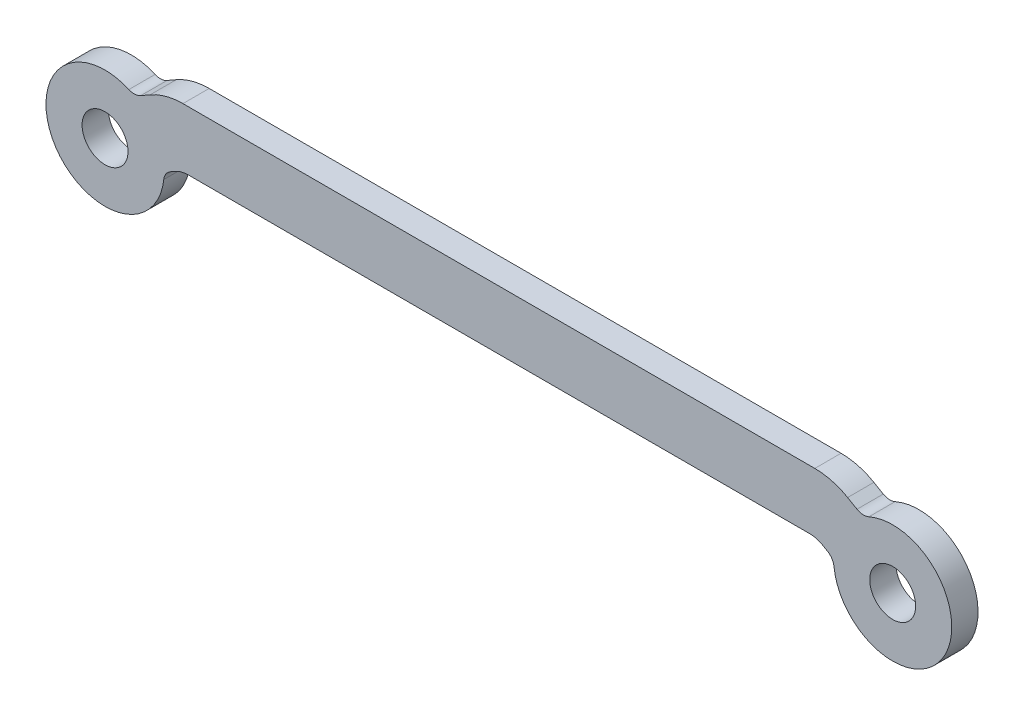
ISO-10303-21;
HEADER;
FILE_DESCRIPTION(('STEP AP214'),'2;1');
FILE_NAME('part.step','',(''),(''),'','','');
FILE_SCHEMA(('AUTOMOTIVE_DESIGN { 1 0 10303 214 1 1 1 1 }'));
ENDSEC;
DATA;
#1=APPLICATION_CONTEXT('core data for automotive mechanical design processes');
#2=APPLICATION_PROTOCOL_DEFINITION('international standard','automotive_design',2000,#1);
#3=PRODUCT_CONTEXT('',#1,'mechanical');
#4=PRODUCT('Part','Part','',(#3));
#5=PRODUCT_RELATED_PRODUCT_CATEGORY('part','',(#4));
#6=PRODUCT_DEFINITION_FORMATION('','',#4);
#7=PRODUCT_DEFINITION_CONTEXT('part definition',#1,'design');
#8=PRODUCT_DEFINITION('design','',#6,#7);
#9=PRODUCT_DEFINITION_SHAPE('','',#8);
#10=(LENGTH_UNIT() NAMED_UNIT(*) SI_UNIT(.MILLI.,.METRE.));
#11=(NAMED_UNIT(*) PLANE_ANGLE_UNIT() SI_UNIT($,.RADIAN.));
#12=(NAMED_UNIT(*) SI_UNIT($,.STERADIAN.) SOLID_ANGLE_UNIT());
#13=UNCERTAINTY_MEASURE_WITH_UNIT(LENGTH_MEASURE(1.E-05),#10,'distance_accuracy_value','');
#14=(GEOMETRIC_REPRESENTATION_CONTEXT(3) GLOBAL_UNCERTAINTY_ASSIGNED_CONTEXT((#13)) GLOBAL_UNIT_ASSIGNED_CONTEXT((#10,
#11,#12)) REPRESENTATION_CONTEXT('',''));
#15=CARTESIAN_POINT('',(0.,0.,0.));
#16=DIRECTION('',(0.,0.,1.));
#17=DIRECTION('',(1.,0.,0.));
#18=AXIS2_PLACEMENT_3D('',#15,#16,#17);
#19=CARTESIAN_POINT('',(54.0669872981077,0.250000000000007,2.));
#20=DIRECTION('',(0.,0.,1.));
#21=DIRECTION('',(1.,0.,0.));
#22=AXIS2_PLACEMENT_3D('',#19,#20,#21);
#23=PLANE('',#22);
#24=CARTESIAN_POINT('',(0.,0.,2.));
#25=DIRECTION('',(0.,0.,1.));
#26=DIRECTION('',(1.,0.,0.));
#27=AXIS2_PLACEMENT_3D('',#24,#25,#26);
#28=CIRCLE('',#27,1.75);
#29=CARTESIAN_POINT('',(1.75000000000005,0.,2.));
#30=VERTEX_POINT('',#29);
#31=EDGE_CURVE('E186',#30,#30,#28,.T.);
#32=ORIENTED_EDGE('',*,*,#31,.F.);
#33=EDGE_LOOP('',(#32));
#34=FACE_BOUND('',#33,.T.);
#35=CARTESIAN_POINT('',(54.0669872981077,0.250000000000007,2.));
#36=DIRECTION('',(0.,0.,1.));
#37=DIRECTION('',(1.,0.,0.));
#38=AXIS2_PLACEMENT_3D('',#35,#36,#37);
#39=CIRCLE('',#38,4.99999999999994);
#40=CARTESIAN_POINT('',(56.5669872981076,4.58012701892215,2.));
#41=VERTEX_POINT('',#40);
#42=CARTESIAN_POINT('',(54.0669872981077,5.24999999999995,2.));
#43=VERTEX_POINT('',#42);
#44=EDGE_CURVE('E213',#41,#43,#39,.T.);
#45=ORIENTED_EDGE('',*,*,#44,.T.);
#46=DIRECTION('',(-1.,0.,0.));
#47=VECTOR('',#46,1.);
#48=CARTESIAN_POINT('',(5.93301270189224,5.25000000000001,2.));
#49=LINE('',#48,#47);
#50=CARTESIAN_POINT('',(5.93301270189224,5.25000000000001,2.));
#51=VERTEX_POINT('',#50);
#52=EDGE_CURVE('E121',#43,#51,#49,.T.);
#53=ORIENTED_EDGE('',*,*,#52,.T.);
#54=CARTESIAN_POINT('',(5.93301270189222,0.250000000000006,2.));
#55=DIRECTION('',(0.,0.,1.));
#56=DIRECTION('',(1.,0.,0.));
#57=AXIS2_PLACEMENT_3D('',#54,#55,#56);
#58=CIRCLE('',#57,5.);
#59=CARTESIAN_POINT('',(3.4330127018922,4.58012701892219,2.));
#60=VERTEX_POINT('',#59);
#61=EDGE_CURVE('E252',#51,#60,#58,.T.);
#62=ORIENTED_EDGE('',*,*,#61,.T.);
#63=DIRECTION('',(-0.866025403784438,-0.500000000000001,0.));
#64=VECTOR('',#63,1.);
#65=CARTESIAN_POINT('',(2.71760653723484,4.16708707717735,2.));
#66=LINE('',#65,#64);
#67=CARTESIAN_POINT('',(2.71760653723484,4.16708707717735,2.));
#68=VERTEX_POINT('',#67);
#69=EDGE_CURVE('E271',#60,#68,#66,.T.);
#70=ORIENTED_EDGE('',*,*,#69,.T.);
#71=CARTESIAN_POINT('',(2.21760653723484,5.03311248096178,2.));
#72=DIRECTION('',(0.,0.,-1.));
#73=DIRECTION('',(-1.,0.,0.));
#74=AXIS2_PLACEMENT_3D('',#71,#72,#73);
#75=CIRCLE('',#74,0.999999999999999);
#76=CARTESIAN_POINT('',(1.8144053486467,4.11800112078693,2.));
#77=VERTEX_POINT('',#76);
#78=EDGE_CURVE('E268',#68,#77,#75,.T.);
#79=ORIENTED_EDGE('',*,*,#78,.T.);
#80=CARTESIAN_POINT('',(0.,0.,2.));
#81=DIRECTION('',(0.,0.,1.));
#82=DIRECTION('',(1.,0.,0.));
#83=AXIS2_PLACEMENT_3D('',#80,#81,#82);
#84=CIRCLE('',#83,4.49999999999994);
#85=CARTESIAN_POINT('',(4.4734962577376,-0.487679435703051,2.));
#86=VERTEX_POINT('',#85);
#87=EDGE_CURVE('E270',#77,#86,#84,.T.);
#88=ORIENTED_EDGE('',*,*,#87,.T.);
#89=CARTESIAN_POINT('',(5.46760653723485,-0.596052643637063,2.));
#90=DIRECTION('',(0.,0.,-1.));
#91=DIRECTION('',(1.,0.,0.));
#92=AXIS2_PLACEMENT_3D('',#89,#90,#91);
#93=CIRCLE('',#92,1.);
#94=CARTESIAN_POINT('',(4.96760653723485,0.269972760147376,2.));
#95=VERTEX_POINT('',#94);
#96=EDGE_CURVE('E273',#86,#95,#93,.T.);
#97=ORIENTED_EDGE('',*,*,#96,.T.);
#98=DIRECTION('',(0.866025403784437,0.500000000000002,0.));
#99=VECTOR('',#98,1.);
#100=CARTESIAN_POINT('',(5.32105175560817,0.474034452119,2.));
#101=LINE('',#100,#99);
#102=CARTESIAN_POINT('',(5.32105175560817,0.474034452119,2.));
#103=VERTEX_POINT('',#102);
#104=EDGE_CURVE('E279',#95,#103,#101,.T.);
#105=ORIENTED_EDGE('',*,*,#104,.T.);
#106=CARTESIAN_POINT('',(6.35096920143865,-1.30983489166095,2.));
#107=DIRECTION('',(0.,0.,-1.));
#108=DIRECTION('',(1.,0.,0.));
#109=AXIS2_PLACEMENT_3D('',#106,#107,#108);
#110=CIRCLE('',#109,2.05983489166095);
#111=CARTESIAN_POINT('',(6.35096920143865,0.750000000000002,2.));
#112=VERTEX_POINT('',#111);
#113=EDGE_CURVE('E281',#103,#112,#110,.T.);
#114=ORIENTED_EDGE('',*,*,#113,.T.);
#115=DIRECTION('',(1.,0.,0.));
#116=VECTOR('',#115,1.);
#117=CARTESIAN_POINT('',(53.665063509461,0.749999999999949,2.));
#118=LINE('',#117,#116);
#119=CARTESIAN_POINT('',(53.665063509461,0.749999999999938,2.));
#120=VERTEX_POINT('',#119);
#121=EDGE_CURVE('E283',#112,#120,#118,.T.);
#122=ORIENTED_EDGE('',*,*,#121,.T.);
#123=CARTESIAN_POINT('',(53.665063509461,-1.24999999999999,2.));
#124=DIRECTION('',(0.,0.,-1.));
#125=DIRECTION('',(1.,0.,0.));
#126=AXIS2_PLACEMENT_3D('',#123,#124,#125);
#127=CIRCLE('',#126,1.99999999999993);
#128=CARTESIAN_POINT('',(54.665063509461,0.482050807568832,2.));
#129=VERTEX_POINT('',#128);
#130=EDGE_CURVE('E285',#120,#129,#127,.T.);
#131=ORIENTED_EDGE('',*,*,#130,.T.);
#132=DIRECTION('',(0.866025403784446,-0.499999999999987,0.));
#133=VECTOR('',#132,1.);
#134=CARTESIAN_POINT('',(55.0323934627651,0.269972760147251,2.));
#135=LINE('',#134,#133);
#136=CARTESIAN_POINT('',(55.0323934627652,0.26997276014726,2.));
#137=VERTEX_POINT('',#136);
#138=EDGE_CURVE('E287',#129,#137,#135,.T.);
#139=ORIENTED_EDGE('',*,*,#138,.T.);
#140=CARTESIAN_POINT('',(54.5323934627651,-0.596052643637157,2.));
#141=DIRECTION('',(0.,0.,-1.));
#142=DIRECTION('',(-1.,0.,0.));
#143=AXIS2_PLACEMENT_3D('',#140,#141,#142);
#144=CIRCLE('',#143,0.999999999999985);
#145=CARTESIAN_POINT('',(55.5265037422624,-0.487679435703169,2.));
#146=VERTEX_POINT('',#145);
#147=EDGE_CURVE('E164',#137,#146,#144,.T.);
#148=ORIENTED_EDGE('',*,*,#147,.T.);
#149=CARTESIAN_POINT('',(60.,0.,2.));
#150=DIRECTION('',(0.,0.,1.));
#151=DIRECTION('',(1.,0.,0.));
#152=AXIS2_PLACEMENT_3D('',#149,#150,#151);
#153=CIRCLE('',#152,4.49999999999999);
#154=CARTESIAN_POINT('',(58.1855946513533,4.11800112078682,2.));
#155=VERTEX_POINT('',#154);
#156=EDGE_CURVE('E158',#146,#155,#153,.T.);
#157=ORIENTED_EDGE('',*,*,#156,.T.);
#158=CARTESIAN_POINT('',(57.7823934627651,5.03311248096171,2.));
#159=DIRECTION('',(0.,0.,-1.));
#160=DIRECTION('',(1.,0.,0.));
#161=AXIS2_PLACEMENT_3D('',#158,#159,#160);
#162=CIRCLE('',#161,1.00000000000001);
#163=CARTESIAN_POINT('',(57.2823934627651,4.16708707717725,2.));
#164=VERTEX_POINT('',#163);
#165=EDGE_CURVE('E162',#155,#164,#162,.T.);
#166=ORIENTED_EDGE('',*,*,#165,.T.);
#167=DIRECTION('',(-0.866025403784443,0.499999999999992,0.));
#168=VECTOR('',#167,1.);
#169=CARTESIAN_POINT('',(56.5669872981076,4.58012701892215,2.));
#170=LINE('',#169,#168);
#171=EDGE_CURVE('E54',#164,#41,#170,.T.);
#172=ORIENTED_EDGE('',*,*,#171,.T.);
#173=EDGE_LOOP('',(#45,#53,#62,#70,#79,#88,#97,#105,#114,#122,#131,#139,#148,#157,#166,#172));
#174=FACE_BOUND('',#173,.T.);
#175=CARTESIAN_POINT('',(60.,0.,2.));
#176=DIRECTION('',(0.,0.,1.));
#177=DIRECTION('',(1.,0.,0.));
#178=AXIS2_PLACEMENT_3D('',#175,#176,#177);
#179=CIRCLE('',#178,1.75);
#180=CARTESIAN_POINT('',(61.75,0.,2.));
#181=VERTEX_POINT('',#180);
#182=EDGE_CURVE('E329',#181,#181,#179,.T.);
#183=ORIENTED_EDGE('',*,*,#182,.F.);
#184=EDGE_LOOP('',(#183));
#185=FACE_BOUND('',#184,.T.);
#186=ADVANCED_FACE('F37',(#34,#174,#185),#23,.T.);
#187=CARTESIAN_POINT('',(54.0669872981077,0.250000000000007,0.));
#188=DIRECTION('',(0.,0.,1.));
#189=DIRECTION('',(1.,0.,0.));
#190=AXIS2_PLACEMENT_3D('',#187,#188,#189);
#191=PLANE('',#190);
#192=CARTESIAN_POINT('',(54.0669872981077,0.250000000000007,0.));
#193=DIRECTION('',(0.,0.,1.));
#194=DIRECTION('',(1.,0.,0.));
#195=AXIS2_PLACEMENT_3D('',#192,#193,#194);
#196=CIRCLE('',#195,4.99999999999994);
#197=CARTESIAN_POINT('',(56.5669872981076,4.58012701892215,0.));
#198=VERTEX_POINT('',#197);
#199=CARTESIAN_POINT('',(54.0669872981077,5.24999999999995,0.));
#200=VERTEX_POINT('',#199);
#201=EDGE_CURVE('E182',#198,#200,#196,.T.);
#202=ORIENTED_EDGE('',*,*,#201,.F.);
#203=DIRECTION('',(-0.866025403784443,0.499999999999992,0.));
#204=VECTOR('',#203,1.);
#205=CARTESIAN_POINT('',(56.5669872981076,4.58012701892215,0.));
#206=LINE('',#205,#204);
#207=CARTESIAN_POINT('',(57.2823934627651,4.16708707717725,0.));
#208=VERTEX_POINT('',#207);
#209=EDGE_CURVE('E113',#208,#198,#206,.T.);
#210=ORIENTED_EDGE('',*,*,#209,.F.);
#211=CARTESIAN_POINT('',(57.7823934627651,5.03311248096171,0.));
#212=DIRECTION('',(0.,0.,-1.));
#213=DIRECTION('',(1.,0.,0.));
#214=AXIS2_PLACEMENT_3D('',#211,#212,#213);
#215=CIRCLE('',#214,1.00000000000001);
#216=CARTESIAN_POINT('',(58.1855946513533,4.11800112078682,0.));
#217=VERTEX_POINT('',#216);
#218=EDGE_CURVE('E107',#217,#208,#215,.T.);
#219=ORIENTED_EDGE('',*,*,#218,.F.);
#220=CARTESIAN_POINT('',(60.,0.,0.));
#221=DIRECTION('',(0.,0.,1.));
#222=DIRECTION('',(1.,0.,0.));
#223=AXIS2_PLACEMENT_3D('',#220,#221,#222);
#224=CIRCLE('',#223,4.49999999999999);
#225=CARTESIAN_POINT('',(55.5265037422624,-0.487679435703169,0.));
#226=VERTEX_POINT('',#225);
#227=EDGE_CURVE('E172',#226,#217,#224,.T.);
#228=ORIENTED_EDGE('',*,*,#227,.F.);
#229=CARTESIAN_POINT('',(54.5323934627651,-0.596052643637157,0.));
#230=DIRECTION('',(0.,0.,-1.));
#231=DIRECTION('',(-1.,0.,0.));
#232=AXIS2_PLACEMENT_3D('',#229,#230,#231);
#233=CIRCLE('',#232,0.999999999999985);
#234=CARTESIAN_POINT('',(55.0323934627652,0.26997276014726,0.));
#235=VERTEX_POINT('',#234);
#236=EDGE_CURVE('E208',#235,#226,#233,.T.);
#237=ORIENTED_EDGE('',*,*,#236,.F.);
#238=DIRECTION('',(0.866025403784446,-0.499999999999987,0.));
#239=VECTOR('',#238,1.);
#240=CARTESIAN_POINT('',(55.0323934627651,0.269972760147251,0.));
#241=LINE('',#240,#239);
#242=CARTESIAN_POINT('',(54.665063509461,0.482050807568832,0.));
#243=VERTEX_POINT('',#242);
#244=EDGE_CURVE('E206',#243,#235,#241,.T.);
#245=ORIENTED_EDGE('',*,*,#244,.F.);
#246=CARTESIAN_POINT('',(53.665063509461,-1.24999999999999,0.));
#247=DIRECTION('',(0.,0.,-1.));
#248=DIRECTION('',(1.,0.,0.));
#249=AXIS2_PLACEMENT_3D('',#246,#247,#248);
#250=CIRCLE('',#249,1.99999999999993);
#251=CARTESIAN_POINT('',(53.665063509461,0.749999999999938,0.));
#252=VERTEX_POINT('',#251);
#253=EDGE_CURVE('E204',#252,#243,#250,.T.);
#254=ORIENTED_EDGE('',*,*,#253,.F.);
#255=DIRECTION('',(1.,0.,0.));
#256=VECTOR('',#255,1.);
#257=CARTESIAN_POINT('',(53.665063509461,0.749999999999949,0.));
#258=LINE('',#257,#256);
#259=CARTESIAN_POINT('',(6.35096920143865,0.750000000000002,0.));
#260=VERTEX_POINT('',#259);
#261=EDGE_CURVE('E202',#260,#252,#258,.T.);
#262=ORIENTED_EDGE('',*,*,#261,.F.);
#263=CARTESIAN_POINT('',(6.35096920143865,-1.30983489166095,0.));
#264=DIRECTION('',(0.,0.,-1.));
#265=DIRECTION('',(1.,0.,0.));
#266=AXIS2_PLACEMENT_3D('',#263,#264,#265);
#267=CIRCLE('',#266,2.05983489166095);
#268=CARTESIAN_POINT('',(5.32105175560817,0.474034452119,0.));
#269=VERTEX_POINT('',#268);
#270=EDGE_CURVE('E200',#269,#260,#267,.T.);
#271=ORIENTED_EDGE('',*,*,#270,.F.);
#272=DIRECTION('',(0.866025403784437,0.500000000000002,0.));
#273=VECTOR('',#272,1.);
#274=CARTESIAN_POINT('',(5.32105175560817,0.474034452119,0.));
#275=LINE('',#274,#273);
#276=CARTESIAN_POINT('',(4.96760653723485,0.269972760147376,0.));
#277=VERTEX_POINT('',#276);
#278=EDGE_CURVE('E198',#277,#269,#275,.T.);
#279=ORIENTED_EDGE('',*,*,#278,.F.);
#280=CARTESIAN_POINT('',(5.46760653723485,-0.596052643637063,0.));
#281=DIRECTION('',(0.,0.,-1.));
#282=DIRECTION('',(1.,0.,0.));
#283=AXIS2_PLACEMENT_3D('',#280,#281,#282);
#284=CIRCLE('',#283,1.);
#285=CARTESIAN_POINT('',(4.4734962577376,-0.487679435703051,0.));
#286=VERTEX_POINT('',#285);
#287=EDGE_CURVE('E196',#286,#277,#284,.T.);
#288=ORIENTED_EDGE('',*,*,#287,.F.);
#289=CARTESIAN_POINT('',(0.,0.,0.));
#290=DIRECTION('',(0.,0.,1.));
#291=DIRECTION('',(1.,0.,0.));
#292=AXIS2_PLACEMENT_3D('',#289,#290,#291);
#293=CIRCLE('',#292,4.49999999999994);
#294=CARTESIAN_POINT('',(1.8144053486467,4.11800112078693,0.));
#295=VERTEX_POINT('',#294);
#296=EDGE_CURVE('E194',#295,#286,#293,.T.);
#297=ORIENTED_EDGE('',*,*,#296,.F.);
#298=CARTESIAN_POINT('',(2.21760653723484,5.03311248096178,0.));
#299=DIRECTION('',(0.,0.,-1.));
#300=DIRECTION('',(-1.,0.,0.));
#301=AXIS2_PLACEMENT_3D('',#298,#299,#300);
#302=CIRCLE('',#301,0.999999999999999);
#303=CARTESIAN_POINT('',(2.71760653723484,4.16708707717735,0.));
#304=VERTEX_POINT('',#303);
#305=EDGE_CURVE('E192',#304,#295,#302,.T.);
#306=ORIENTED_EDGE('',*,*,#305,.F.);
#307=DIRECTION('',(-0.866025403784438,-0.500000000000001,0.));
#308=VECTOR('',#307,1.);
#309=CARTESIAN_POINT('',(2.71760653723484,4.16708707717735,0.));
#310=LINE('',#309,#308);
#311=CARTESIAN_POINT('',(3.4330127018922,4.58012701892219,0.));
#312=VERTEX_POINT('',#311);
#313=EDGE_CURVE('E190',#312,#304,#310,.T.);
#314=ORIENTED_EDGE('',*,*,#313,.F.);
#315=CARTESIAN_POINT('',(5.93301270189222,0.250000000000006,0.));
#316=DIRECTION('',(0.,0.,1.));
#317=DIRECTION('',(1.,0.,0.));
#318=AXIS2_PLACEMENT_3D('',#315,#316,#317);
#319=CIRCLE('',#318,5.);
#320=CARTESIAN_POINT('',(5.93301270189224,5.25000000000001,0.));
#321=VERTEX_POINT('',#320);
#322=EDGE_CURVE('E188',#321,#312,#319,.T.);
#323=ORIENTED_EDGE('',*,*,#322,.F.);
#324=DIRECTION('',(-1.,0.,0.));
#325=VECTOR('',#324,1.);
#326=CARTESIAN_POINT('',(5.93301270189224,5.25000000000001,0.));
#327=LINE('',#326,#325);
#328=EDGE_CURVE('E185',#200,#321,#327,.T.);
#329=ORIENTED_EDGE('',*,*,#328,.F.);
#330=EDGE_LOOP('',(#202,#210,#219,#228,#237,#245,#254,#262,#271,#279,#288,#297,#306,#314,#323,#329));
#331=FACE_BOUND('',#330,.T.);
#332=CARTESIAN_POINT('',(0.,0.,0.));
#333=DIRECTION('',(0.,0.,1.));
#334=DIRECTION('',(1.,0.,0.));
#335=AXIS2_PLACEMENT_3D('',#332,#333,#334);
#336=CIRCLE('',#335,1.75);
#337=CARTESIAN_POINT('',(1.75000000000005,0.,0.));
#338=VERTEX_POINT('',#337);
#339=EDGE_CURVE('E335',#338,#338,#336,.T.);
#340=ORIENTED_EDGE('',*,*,#339,.T.);
#341=EDGE_LOOP('',(#340));
#342=FACE_BOUND('',#341,.T.);
#343=CARTESIAN_POINT('',(60.,0.,0.));
#344=DIRECTION('',(0.,0.,1.));
#345=DIRECTION('',(1.,0.,0.));
#346=AXIS2_PLACEMENT_3D('',#343,#344,#345);
#347=CIRCLE('',#346,1.75);
#348=CARTESIAN_POINT('',(61.75,0.,0.));
#349=VERTEX_POINT('',#348);
#350=EDGE_CURVE('E332',#349,#349,#347,.T.);
#351=ORIENTED_EDGE('',*,*,#350,.T.);
#352=EDGE_LOOP('',(#351));
#353=FACE_BOUND('',#352,.T.);
#354=ADVANCED_FACE('F256',(#331,#342,#353),#191,.F.);
#355=CARTESIAN_POINT('',(54.0669872981077,0.250000000000007,2.));
#356=DIRECTION('',(0.,0.,-1.));
#357=DIRECTION('',(-1.,0.,0.));
#358=AXIS2_PLACEMENT_3D('',#355,#356,#357);
#359=CYLINDRICAL_SURFACE('',#358,4.99999999999994);
#360=ORIENTED_EDGE('',*,*,#201,.T.);
#361=DIRECTION('',(0.,0.,-1.));
#362=VECTOR('',#361,1.);
#363=CARTESIAN_POINT('',(54.0669872981077,5.24999999999995,2.));
#364=LINE('',#363,#362);
#365=EDGE_CURVE('E11',#43,#200,#364,.T.);
#366=ORIENTED_EDGE('',*,*,#365,.F.);
#367=ORIENTED_EDGE('',*,*,#44,.F.);
#368=DIRECTION('',(0.,0.,-1.));
#369=VECTOR('',#368,1.);
#370=CARTESIAN_POINT('',(56.5669872981076,4.58012701892215,2.));
#371=LINE('',#370,#369);
#372=EDGE_CURVE('E178',#41,#198,#371,.T.);
#373=ORIENTED_EDGE('',*,*,#372,.T.);
#374=EDGE_LOOP('',(#360,#366,#367,#373));
#375=FACE_BOUND('',#374,.T.);
#376=ADVANCED_FACE('F39',(#375),#359,.T.);
#377=CARTESIAN_POINT('',(5.93301270189224,5.25000000000001,2.));
#378=DIRECTION('',(0.,-1.,0.));
#379=DIRECTION('',(1.,0.,0.));
#380=AXIS2_PLACEMENT_3D('',#377,#378,#379);
#381=PLANE('',#380);
#382=ORIENTED_EDGE('',*,*,#328,.T.);
#383=DIRECTION('',(0.,0.,-1.));
#384=VECTOR('',#383,1.);
#385=CARTESIAN_POINT('',(5.93301270189224,5.25000000000001,2.));
#386=LINE('',#385,#384);
#387=EDGE_CURVE('E46',#51,#321,#386,.T.);
#388=ORIENTED_EDGE('',*,*,#387,.F.);
#389=ORIENTED_EDGE('',*,*,#52,.F.);
#390=ORIENTED_EDGE('',*,*,#365,.T.);
#391=EDGE_LOOP('',(#382,#388,#389,#390));
#392=FACE_BOUND('',#391,.T.);
#393=ADVANCED_FACE('F440',(#392),#381,.F.);
#394=CARTESIAN_POINT('',(5.93301270189222,0.250000000000006,2.));
#395=DIRECTION('',(0.,0.,-1.));
#396=DIRECTION('',(-1.,0.,0.));
#397=AXIS2_PLACEMENT_3D('',#394,#395,#396);
#398=CYLINDRICAL_SURFACE('',#397,5.);
#399=ORIENTED_EDGE('',*,*,#322,.T.);
#400=DIRECTION('',(0.,0.,-1.));
#401=VECTOR('',#400,1.);
#402=CARTESIAN_POINT('',(3.4330127018922,4.58012701892219,2.));
#403=LINE('',#402,#401);
#404=EDGE_CURVE('E244',#60,#312,#403,.T.);
#405=ORIENTED_EDGE('',*,*,#404,.F.);
#406=ORIENTED_EDGE('',*,*,#61,.F.);
#407=ORIENTED_EDGE('',*,*,#387,.T.);
#408=EDGE_LOOP('',(#399,#405,#406,#407));
#409=FACE_BOUND('',#408,.T.);
#410=ADVANCED_FACE('F250',(#409),#398,.T.);
#411=CARTESIAN_POINT('',(2.71760653723484,4.16708707717735,2.));
#412=DIRECTION('',(0.500000000000001,-0.866025403784438,0.));
#413=DIRECTION('',(0.866025403784438,0.500000000000001,0.));
#414=AXIS2_PLACEMENT_3D('',#411,#412,#413);
#415=PLANE('',#414);
#416=ORIENTED_EDGE('',*,*,#313,.T.);
#417=DIRECTION('',(0.,0.,-1.));
#418=VECTOR('',#417,1.);
#419=CARTESIAN_POINT('',(2.71760653723484,4.16708707717735,2.));
#420=LINE('',#419,#418);
#421=EDGE_CURVE('E241',#68,#304,#420,.T.);
#422=ORIENTED_EDGE('',*,*,#421,.F.);
#423=ORIENTED_EDGE('',*,*,#69,.F.);
#424=ORIENTED_EDGE('',*,*,#404,.T.);
#425=EDGE_LOOP('',(#416,#422,#423,#424));
#426=FACE_BOUND('',#425,.T.);
#427=ADVANCED_FACE('F262',(#426),#415,.F.);
#428=CARTESIAN_POINT('',(2.21760653723484,5.03311248096178,2.));
#429=DIRECTION('',(0.,0.,-1.));
#430=DIRECTION('',(-1.,0.,0.));
#431=AXIS2_PLACEMENT_3D('',#428,#429,#430);
#432=CYLINDRICAL_SURFACE('',#431,0.999999999999999);
#433=ORIENTED_EDGE('',*,*,#305,.T.);
#434=DIRECTION('',(0.,0.,-1.));
#435=VECTOR('',#434,1.);
#436=CARTESIAN_POINT('',(1.8144053486467,4.11800112078693,2.));
#437=LINE('',#436,#435);
#438=EDGE_CURVE('E238',#77,#295,#437,.T.);
#439=ORIENTED_EDGE('',*,*,#438,.F.);
#440=ORIENTED_EDGE('',*,*,#78,.F.);
#441=ORIENTED_EDGE('',*,*,#421,.T.);
#442=EDGE_LOOP('',(#433,#439,#440,#441));
#443=FACE_BOUND('',#442,.T.);
#444=ADVANCED_FACE('F266',(#443),#432,.F.);
#445=CARTESIAN_POINT('',(0.,0.,2.));
#446=DIRECTION('',(0.,0.,-1.));
#447=DIRECTION('',(-1.,0.,0.));
#448=AXIS2_PLACEMENT_3D('',#445,#446,#447);
#449=CYLINDRICAL_SURFACE('',#448,4.49999999999994);
#450=ORIENTED_EDGE('',*,*,#296,.T.);
#451=DIRECTION('',(0.,0.,-1.));
#452=VECTOR('',#451,1.);
#453=CARTESIAN_POINT('',(4.4734962577376,-0.487679435703051,2.));
#454=LINE('',#453,#452);
#455=EDGE_CURVE('E235',#86,#286,#454,.T.);
#456=ORIENTED_EDGE('',*,*,#455,.F.);
#457=ORIENTED_EDGE('',*,*,#87,.F.);
#458=ORIENTED_EDGE('',*,*,#438,.T.);
#459=EDGE_LOOP('',(#450,#456,#457,#458));
#460=FACE_BOUND('',#459,.T.);
#461=ADVANCED_FACE('F413',(#460),#449,.T.);
#462=CARTESIAN_POINT('',(5.46760653723485,-0.596052643637063,2.));
#463=DIRECTION('',(0.,0.,-1.));
#464=DIRECTION('',(-1.,0.,0.));
#465=AXIS2_PLACEMENT_3D('',#462,#463,#464);
#466=CYLINDRICAL_SURFACE('',#465,1.);
#467=ORIENTED_EDGE('',*,*,#287,.T.);
#468=DIRECTION('',(0.,0.,-1.));
#469=VECTOR('',#468,1.);
#470=CARTESIAN_POINT('',(4.96760653723485,0.269972760147376,2.));
#471=LINE('',#470,#469);
#472=EDGE_CURVE('E232',#95,#277,#471,.T.);
#473=ORIENTED_EDGE('',*,*,#472,.F.);
#474=ORIENTED_EDGE('',*,*,#96,.F.);
#475=ORIENTED_EDGE('',*,*,#455,.T.);
#476=EDGE_LOOP('',(#467,#473,#474,#475));
#477=FACE_BOUND('',#476,.T.);
#478=ADVANCED_FACE('F405',(#477),#466,.F.);
#479=CARTESIAN_POINT('',(5.32105175560817,0.474034452119,2.));
#480=DIRECTION('',(-0.500000000000002,0.866025403784438,0.));
#481=DIRECTION('',(-0.866025403784437,-0.500000000000002,0.));
#482=AXIS2_PLACEMENT_3D('',#479,#480,#481);
#483=PLANE('',#482);
#484=ORIENTED_EDGE('',*,*,#278,.T.);
#485=DIRECTION('',(0.,0.,-1.));
#486=VECTOR('',#485,1.);
#487=CARTESIAN_POINT('',(5.32105175560817,0.474034452119,2.));
#488=LINE('',#487,#486);
#489=EDGE_CURVE('E229',#103,#269,#488,.T.);
#490=ORIENTED_EDGE('',*,*,#489,.F.);
#491=ORIENTED_EDGE('',*,*,#104,.F.);
#492=ORIENTED_EDGE('',*,*,#472,.T.);
#493=EDGE_LOOP('',(#484,#490,#491,#492));
#494=FACE_BOUND('',#493,.T.);
#495=ADVANCED_FACE('F397',(#494),#483,.F.);
#496=CARTESIAN_POINT('',(6.35096920143865,-1.30983489166095,2.));
#497=DIRECTION('',(0.,0.,-1.));
#498=DIRECTION('',(-1.,0.,0.));
#499=AXIS2_PLACEMENT_3D('',#496,#497,#498);
#500=CYLINDRICAL_SURFACE('',#499,2.05983489166095);
#501=ORIENTED_EDGE('',*,*,#270,.T.);
#502=DIRECTION('',(0.,0.,-1.));
#503=VECTOR('',#502,1.);
#504=CARTESIAN_POINT('',(6.35096920143865,0.750000000000002,2.));
#505=LINE('',#504,#503);
#506=EDGE_CURVE('E226',#112,#260,#505,.T.);
#507=ORIENTED_EDGE('',*,*,#506,.F.);
#508=ORIENTED_EDGE('',*,*,#113,.F.);
#509=ORIENTED_EDGE('',*,*,#489,.T.);
#510=EDGE_LOOP('',(#501,#507,#508,#509));
#511=FACE_BOUND('',#510,.T.);
#512=ADVANCED_FACE('F389',(#511),#500,.F.);
#513=CARTESIAN_POINT('',(53.665063509461,0.749999999999949,2.));
#514=DIRECTION('',(0.,1.,0.));
#515=DIRECTION('',(-1.,0.,0.));
#516=AXIS2_PLACEMENT_3D('',#513,#514,#515);
#517=PLANE('',#516);
#518=ORIENTED_EDGE('',*,*,#261,.T.);
#519=DIRECTION('',(0.,0.,-1.));
#520=VECTOR('',#519,1.);
#521=CARTESIAN_POINT('',(53.665063509461,0.749999999999938,2.));
#522=LINE('',#521,#520);
#523=EDGE_CURVE('E223',#120,#252,#522,.T.);
#524=ORIENTED_EDGE('',*,*,#523,.F.);
#525=ORIENTED_EDGE('',*,*,#121,.F.);
#526=ORIENTED_EDGE('',*,*,#506,.T.);
#527=EDGE_LOOP('',(#518,#524,#525,#526));
#528=FACE_BOUND('',#527,.T.);
#529=ADVANCED_FACE('F381',(#528),#517,.F.);
#530=CARTESIAN_POINT('',(53.665063509461,-1.24999999999999,2.));
#531=DIRECTION('',(0.,0.,-1.));
#532=DIRECTION('',(-1.,0.,0.));
#533=AXIS2_PLACEMENT_3D('',#530,#531,#532);
#534=CYLINDRICAL_SURFACE('',#533,1.99999999999993);
#535=ORIENTED_EDGE('',*,*,#253,.T.);
#536=DIRECTION('',(0.,0.,-1.));
#537=VECTOR('',#536,1.);
#538=CARTESIAN_POINT('',(54.665063509461,0.482050807568832,2.));
#539=LINE('',#538,#537);
#540=EDGE_CURVE('E220',#129,#243,#539,.T.);
#541=ORIENTED_EDGE('',*,*,#540,.F.);
#542=ORIENTED_EDGE('',*,*,#130,.F.);
#543=ORIENTED_EDGE('',*,*,#523,.T.);
#544=EDGE_LOOP('',(#535,#541,#542,#543));
#545=FACE_BOUND('',#544,.T.);
#546=ADVANCED_FACE('F374',(#545),#534,.F.);
#547=CARTESIAN_POINT('',(55.0323934627651,0.269972760147251,2.));
#548=DIRECTION('',(0.499999999999987,0.866025403784446,0.));
#549=DIRECTION('',(-0.866025403784446,0.499999999999987,0.));
#550=AXIS2_PLACEMENT_3D('',#547,#548,#549);
#551=PLANE('',#550);
#552=ORIENTED_EDGE('',*,*,#244,.T.);
#553=DIRECTION('',(0.,0.,-1.));
#554=VECTOR('',#553,1.);
#555=CARTESIAN_POINT('',(55.0323934627652,0.26997276014726,2.));
#556=LINE('',#555,#554);
#557=EDGE_CURVE('E217',#137,#235,#556,.T.);
#558=ORIENTED_EDGE('',*,*,#557,.F.);
#559=ORIENTED_EDGE('',*,*,#138,.F.);
#560=ORIENTED_EDGE('',*,*,#540,.T.);
#561=EDGE_LOOP('',(#552,#558,#559,#560));
#562=FACE_BOUND('',#561,.T.);
#563=ADVANCED_FACE('F293',(#562),#551,.F.);
#564=CARTESIAN_POINT('',(54.5323934627651,-0.596052643637157,2.));
#565=DIRECTION('',(0.,0.,-1.));
#566=DIRECTION('',(-1.,0.,0.));
#567=AXIS2_PLACEMENT_3D('',#564,#565,#566);
#568=CYLINDRICAL_SURFACE('',#567,0.999999999999985);
#569=ORIENTED_EDGE('',*,*,#236,.T.);
#570=DIRECTION('',(0.,0.,-1.));
#571=VECTOR('',#570,1.);
#572=CARTESIAN_POINT('',(55.5265037422624,-0.487679435703169,2.));
#573=LINE('',#572,#571);
#574=EDGE_CURVE('E173',#146,#226,#573,.T.);
#575=ORIENTED_EDGE('',*,*,#574,.F.);
#576=ORIENTED_EDGE('',*,*,#147,.F.);
#577=ORIENTED_EDGE('',*,*,#557,.T.);
#578=EDGE_LOOP('',(#569,#575,#576,#577));
#579=FACE_BOUND('',#578,.T.);
#580=ADVANCED_FACE('F297',(#579),#568,.F.);
#581=CARTESIAN_POINT('',(60.,0.,2.));
#582=DIRECTION('',(0.,0.,-1.));
#583=DIRECTION('',(-1.,0.,0.));
#584=AXIS2_PLACEMENT_3D('',#581,#582,#583);
#585=CYLINDRICAL_SURFACE('',#584,4.49999999999999);
#586=ORIENTED_EDGE('',*,*,#227,.T.);
#587=DIRECTION('',(0.,0.,-1.));
#588=VECTOR('',#587,1.);
#589=CARTESIAN_POINT('',(58.1855946513533,4.11800112078682,2.));
#590=LINE('',#589,#588);
#591=EDGE_CURVE('E169',#155,#217,#590,.T.);
#592=ORIENTED_EDGE('',*,*,#591,.F.);
#593=ORIENTED_EDGE('',*,*,#156,.F.);
#594=ORIENTED_EDGE('',*,*,#574,.T.);
#595=EDGE_LOOP('',(#586,#592,#593,#594));
#596=FACE_BOUND('',#595,.T.);
#597=ADVANCED_FACE('F170',(#596),#585,.T.);
#598=CARTESIAN_POINT('',(57.7823934627651,5.03311248096171,2.));
#599=DIRECTION('',(0.,0.,-1.));
#600=DIRECTION('',(-1.,0.,0.));
#601=AXIS2_PLACEMENT_3D('',#598,#599,#600);
#602=CYLINDRICAL_SURFACE('',#601,1.00000000000001);
#603=ORIENTED_EDGE('',*,*,#218,.T.);
#604=DIRECTION('',(0.,0.,-1.));
#605=VECTOR('',#604,1.);
#606=CARTESIAN_POINT('',(57.2823934627651,4.16708707717725,2.));
#607=LINE('',#606,#605);
#608=EDGE_CURVE('E174',#164,#208,#607,.T.);
#609=ORIENTED_EDGE('',*,*,#608,.F.);
#610=ORIENTED_EDGE('',*,*,#165,.F.);
#611=ORIENTED_EDGE('',*,*,#591,.T.);
#612=EDGE_LOOP('',(#603,#609,#610,#611));
#613=FACE_BOUND('',#612,.T.);
#614=ADVANCED_FACE('F176',(#613),#602,.F.);
#615=CARTESIAN_POINT('',(56.5669872981076,4.58012701892215,2.));
#616=DIRECTION('',(-0.499999999999992,-0.866025403784443,0.));
#617=DIRECTION('',(0.866025403784443,-0.499999999999992,0.));
#618=AXIS2_PLACEMENT_3D('',#615,#616,#617);
#619=PLANE('',#618);
#620=ORIENTED_EDGE('',*,*,#209,.T.);
#621=ORIENTED_EDGE('',*,*,#372,.F.);
#622=ORIENTED_EDGE('',*,*,#171,.F.);
#623=ORIENTED_EDGE('',*,*,#608,.T.);
#624=EDGE_LOOP('',(#620,#621,#622,#623));
#625=FACE_BOUND('',#624,.T.);
#626=ADVANCED_FACE('F301',(#625),#619,.F.);
#627=CARTESIAN_POINT('',(0.,0.,2.));
#628=DIRECTION('',(0.,0.,-1.));
#629=DIRECTION('',(-1.,0.,0.));
#630=AXIS2_PLACEMENT_3D('',#627,#628,#629);
#631=CYLINDRICAL_SURFACE('',#630,1.75);
#632=ORIENTED_EDGE('',*,*,#31,.T.);
#633=EDGE_LOOP('',(#632));
#634=FACE_BOUND('',#633,.T.);
#635=ORIENTED_EDGE('',*,*,#339,.F.);
#636=EDGE_LOOP('',(#635));
#637=FACE_BOUND('',#636,.T.);
#638=ADVANCED_FACE('F303',(#634,#637),#631,.F.);
#639=CARTESIAN_POINT('',(60.,0.,2.));
#640=DIRECTION('',(0.,0.,-1.));
#641=DIRECTION('',(-1.,0.,0.));
#642=AXIS2_PLACEMENT_3D('',#639,#640,#641);
#643=CYLINDRICAL_SURFACE('',#642,1.75);
#644=ORIENTED_EDGE('',*,*,#182,.T.);
#645=EDGE_LOOP('',(#644));
#646=FACE_BOUND('',#645,.T.);
#647=ORIENTED_EDGE('',*,*,#350,.F.);
#648=EDGE_LOOP('',(#647));
#649=FACE_BOUND('',#648,.T.);
#650=ADVANCED_FACE('F309',(#646,#649),#643,.F.);
#651=CLOSED_SHELL('',(#186,#354,#376,#393,#410,#427,#444,#461,#478,#495,#512,#529,#546,#563,
#580,#597,#614,#626,#638,#650));
#652=MANIFOLD_SOLID_BREP('B2',#651);
#653=ADVANCED_BREP_SHAPE_REPRESENTATION('',(#18,#652),#14);
#654=SHAPE_DEFINITION_REPRESENTATION(#9,#653);
ENDSEC;
END-ISO-10303-21;
